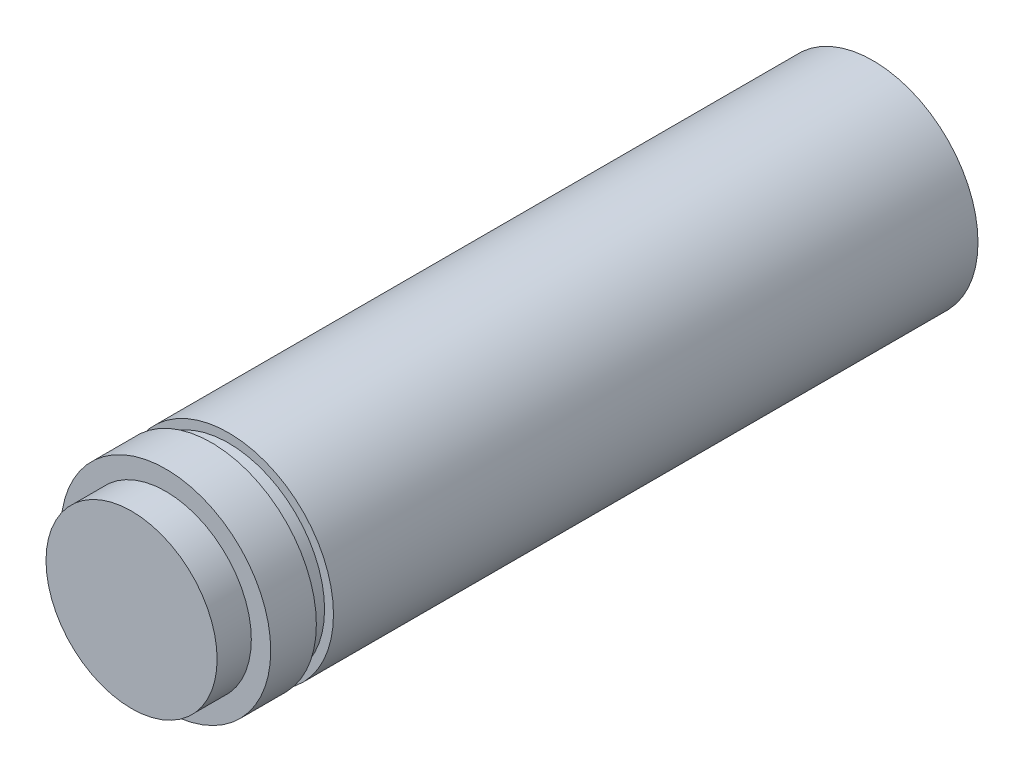
ISO-10303-21;
HEADER;
FILE_DESCRIPTION(('STEP AP214'),'2;1');
FILE_NAME('part.step','',(''),(''),'','','');
FILE_SCHEMA(('AUTOMOTIVE_DESIGN { 1 0 10303 214 1 1 1 1 }'));
ENDSEC;
DATA;
#1=APPLICATION_CONTEXT('core data for automotive mechanical design processes');
#2=APPLICATION_PROTOCOL_DEFINITION('international standard','automotive_design',2000,#1);
#3=PRODUCT_CONTEXT('',#1,'mechanical');
#4=PRODUCT('Part','Part','',(#3));
#5=PRODUCT_RELATED_PRODUCT_CATEGORY('part','',(#4));
#6=PRODUCT_DEFINITION_FORMATION('','',#4);
#7=PRODUCT_DEFINITION_CONTEXT('part definition',#1,'design');
#8=PRODUCT_DEFINITION('design','',#6,#7);
#9=PRODUCT_DEFINITION_SHAPE('','',#8);
#10=(LENGTH_UNIT() NAMED_UNIT(*) SI_UNIT(.MILLI.,.METRE.));
#11=(NAMED_UNIT(*) PLANE_ANGLE_UNIT() SI_UNIT($,.RADIAN.));
#12=(NAMED_UNIT(*) SI_UNIT($,.STERADIAN.) SOLID_ANGLE_UNIT());
#13=UNCERTAINTY_MEASURE_WITH_UNIT(LENGTH_MEASURE(1.E-05),#10,'distance_accuracy_value','');
#14=(GEOMETRIC_REPRESENTATION_CONTEXT(3) GLOBAL_UNCERTAINTY_ASSIGNED_CONTEXT((#13)) GLOBAL_UNIT_ASSIGNED_CONTEXT((#10,
#11,#12)) REPRESENTATION_CONTEXT('',''));
#15=CARTESIAN_POINT('',(0.,0.,0.));
#16=DIRECTION('',(0.,0.,1.));
#17=DIRECTION('',(1.,0.,0.));
#18=AXIS2_PLACEMENT_3D('',#15,#16,#17);
#19=CARTESIAN_POINT('',(0.,0.,65.));
#20=DIRECTION('',(0.,0.,-1.));
#21=DIRECTION('',(-1.,0.,0.));
#22=AXIS2_PLACEMENT_3D('',#19,#20,#21);
#23=CYLINDRICAL_SURFACE('',#22,9.2);
#24=CARTESIAN_POINT('',(0.,0.,58.));
#25=DIRECTION('',(0.,0.,1.));
#26=DIRECTION('',(1.,0.,0.));
#27=AXIS2_PLACEMENT_3D('',#24,#25,#26);
#28=CIRCLE('',#27,9.2);
#29=CARTESIAN_POINT('',(9.2,0.,58.));
#30=VERTEX_POINT('',#29);
#31=EDGE_CURVE('E54',#30,#30,#28,.T.);
#32=ORIENTED_EDGE('',*,*,#31,.T.);
#33=EDGE_LOOP('',(#32));
#34=FACE_BOUND('',#33,.T.);
#35=CARTESIAN_POINT('',(0.,0.,62.));
#36=DIRECTION('',(0.,0.,1.));
#37=DIRECTION('',(1.,0.,0.));
#38=AXIS2_PLACEMENT_3D('',#35,#36,#37);
#39=CIRCLE('',#38,9.2);
#40=CARTESIAN_POINT('',(9.2,0.,62.));
#41=VERTEX_POINT('',#40);
#42=EDGE_CURVE('E40',#41,#41,#39,.T.);
#43=ORIENTED_EDGE('',*,*,#42,.F.);
#44=EDGE_LOOP('',(#43));
#45=FACE_BOUND('',#44,.T.);
#46=ADVANCED_FACE('F34',(#34,#45),#23,.T.);
#47=CARTESIAN_POINT('',(0.,0.,62.));
#48=DIRECTION('',(0.,0.,1.));
#49=DIRECTION('',(1.,0.,0.));
#50=AXIS2_PLACEMENT_3D('',#47,#48,#49);
#51=PLANE('',#50);
#52=CARTESIAN_POINT('',(0.,0.,62.));
#53=DIRECTION('',(0.,0.,1.));
#54=DIRECTION('',(1.,0.,0.));
#55=AXIS2_PLACEMENT_3D('',#52,#53,#54);
#56=CIRCLE('',#55,7.5);
#57=CARTESIAN_POINT('',(7.5,0.,62.));
#58=VERTEX_POINT('',#57);
#59=EDGE_CURVE('E44',#58,#58,#56,.T.);
#60=ORIENTED_EDGE('',*,*,#59,.F.);
#61=EDGE_LOOP('',(#60));
#62=FACE_BOUND('',#61,.T.);
#63=ORIENTED_EDGE('',*,*,#42,.T.);
#64=EDGE_LOOP('',(#63));
#65=FACE_BOUND('',#64,.T.);
#66=ADVANCED_FACE('F85',(#62,#65),#51,.T.);
#67=CARTESIAN_POINT('',(0.,0.,62.));
#68=DIRECTION('',(0.,0.,1.));
#69=DIRECTION('',(1.,0.,0.));
#70=AXIS2_PLACEMENT_3D('',#67,#68,#69);
#71=CYLINDRICAL_SURFACE('',#70,7.5);
#72=ORIENTED_EDGE('',*,*,#59,.T.);
#73=EDGE_LOOP('',(#72));
#74=FACE_BOUND('',#73,.T.);
#75=CARTESIAN_POINT('',(0.,0.,65.));
#76=DIRECTION('',(0.,0.,1.));
#77=DIRECTION('',(1.,0.,0.));
#78=AXIS2_PLACEMENT_3D('',#75,#76,#77);
#79=CIRCLE('',#78,7.5);
#80=CARTESIAN_POINT('',(7.5,0.,65.));
#81=VERTEX_POINT('',#80);
#82=EDGE_CURVE('E48',#81,#81,#79,.T.);
#83=ORIENTED_EDGE('',*,*,#82,.F.);
#84=EDGE_LOOP('',(#83));
#85=FACE_BOUND('',#84,.T.);
#86=ADVANCED_FACE('F90',(#74,#85),#71,.T.);
#87=CARTESIAN_POINT('',(0.,0.,65.));
#88=DIRECTION('',(0.,0.,1.));
#89=DIRECTION('',(1.,0.,0.));
#90=AXIS2_PLACEMENT_3D('',#87,#88,#89);
#91=PLANE('',#90);
#92=ORIENTED_EDGE('',*,*,#82,.T.);
#93=EDGE_LOOP('',(#92));
#94=FACE_BOUND('',#93,.T.);
#95=ADVANCED_FACE('F73',(#94),#91,.T.);
#96=CARTESIAN_POINT('',(0.,0.,56.5));
#97=DIRECTION('',(0.,0.,1.));
#98=DIRECTION('',(1.,0.,0.));
#99=AXIS2_PLACEMENT_3D('',#96,#97,#98);
#100=PLANE('',#99);
#101=CARTESIAN_POINT('',(0.,0.,56.5));
#102=DIRECTION('',(0.,0.,1.));
#103=DIRECTION('',(1.,0.,0.));
#104=AXIS2_PLACEMENT_3D('',#101,#102,#103);
#105=CIRCLE('',#104,8.41957746538452);
#106=CARTESIAN_POINT('',(8.41957746538452,0.,56.5));
#107=VERTEX_POINT('',#106);
#108=EDGE_CURVE('E57',#107,#107,#105,.T.);
#109=ORIENTED_EDGE('',*,*,#108,.F.);
#110=EDGE_LOOP('',(#109));
#111=FACE_BOUND('',#110,.T.);
#112=CARTESIAN_POINT('',(0.,0.,56.5));
#113=DIRECTION('',(0.,0.,1.));
#114=DIRECTION('',(1.,0.,0.));
#115=AXIS2_PLACEMENT_3D('',#112,#113,#114);
#116=CIRCLE('',#115,9.2);
#117=CARTESIAN_POINT('',(9.2,0.,56.5));
#118=VERTEX_POINT('',#117);
#119=EDGE_CURVE('E52',#118,#118,#116,.T.);
#120=ORIENTED_EDGE('',*,*,#119,.T.);
#121=EDGE_LOOP('',(#120));
#122=FACE_BOUND('',#121,.T.);
#123=ADVANCED_FACE('F69',(#111,#122),#100,.T.);
#124=CARTESIAN_POINT('',(0.,0.,58.));
#125=DIRECTION('',(0.,0.,1.));
#126=DIRECTION('',(1.,0.,0.));
#127=AXIS2_PLACEMENT_3D('',#124,#125,#126);
#128=PLANE('',#127);
#129=CARTESIAN_POINT('',(0.,0.,58.));
#130=DIRECTION('',(0.,0.,1.));
#131=DIRECTION('',(1.,0.,0.));
#132=AXIS2_PLACEMENT_3D('',#129,#130,#131);
#133=CIRCLE('',#132,8.41957746538452);
#134=CARTESIAN_POINT('',(8.41957746538452,0.,58.));
#135=VERTEX_POINT('',#134);
#136=EDGE_CURVE('E60',#135,#135,#133,.T.);
#137=ORIENTED_EDGE('',*,*,#136,.T.);
#138=EDGE_LOOP('',(#137));
#139=FACE_BOUND('',#138,.T.);
#140=ORIENTED_EDGE('',*,*,#31,.F.);
#141=EDGE_LOOP('',(#140));
#142=FACE_BOUND('',#141,.T.);
#143=ADVANCED_FACE('F72',(#139,#142),#128,.F.);
#144=CARTESIAN_POINT('',(0.,0.,56.5));
#145=DIRECTION('',(0.,0.,1.));
#146=DIRECTION('',(1.,0.,0.));
#147=AXIS2_PLACEMENT_3D('',#144,#145,#146);
#148=CYLINDRICAL_SURFACE('',#147,8.41957746538452);
#149=ORIENTED_EDGE('',*,*,#108,.T.);
#150=EDGE_LOOP('',(#149));
#151=FACE_BOUND('',#150,.T.);
#152=ORIENTED_EDGE('',*,*,#136,.F.);
#153=EDGE_LOOP('',(#152));
#154=FACE_BOUND('',#153,.T.);
#155=ADVANCED_FACE('F66',(#151,#154),#148,.T.);
#156=CARTESIAN_POINT('',(0.,0.,0.));
#157=DIRECTION('',(0.,0.,1.));
#158=DIRECTION('',(1.,0.,0.));
#159=AXIS2_PLACEMENT_3D('',#156,#157,#158);
#160=PLANE('',#159);
#161=CARTESIAN_POINT('',(0.,0.,0.));
#162=DIRECTION('',(0.,0.,1.));
#163=DIRECTION('',(1.,0.,0.));
#164=AXIS2_PLACEMENT_3D('',#161,#162,#163);
#165=CIRCLE('',#164,9.2);
#166=CARTESIAN_POINT('',(9.2,0.,0.));
#167=VERTEX_POINT('',#166);
#168=EDGE_CURVE('E10',#167,#167,#165,.T.);
#169=ORIENTED_EDGE('',*,*,#168,.F.);
#170=EDGE_LOOP('',(#169));
#171=FACE_BOUND('',#170,.T.);
#172=ADVANCED_FACE('F79',(#171),#160,.F.);
#173=ORIENTED_EDGE('',*,*,#168,.T.);
#174=EDGE_LOOP('',(#173));
#175=FACE_BOUND('',#174,.T.);
#176=ORIENTED_EDGE('',*,*,#119,.F.);
#177=EDGE_LOOP('',(#176));
#178=FACE_BOUND('',#177,.T.);
#179=ADVANCED_FACE('F77',(#175,#178),#23,.T.);
#180=CLOSED_SHELL('',(#46,#66,#86,#95,#123,#143,#155,#172,#179));
#181=MANIFOLD_SOLID_BREP('B2',#180);
#182=ADVANCED_BREP_SHAPE_REPRESENTATION('',(#18,#181),#14);
#183=SHAPE_DEFINITION_REPRESENTATION(#9,#182);
ENDSEC;
END-ISO-10303-21;
